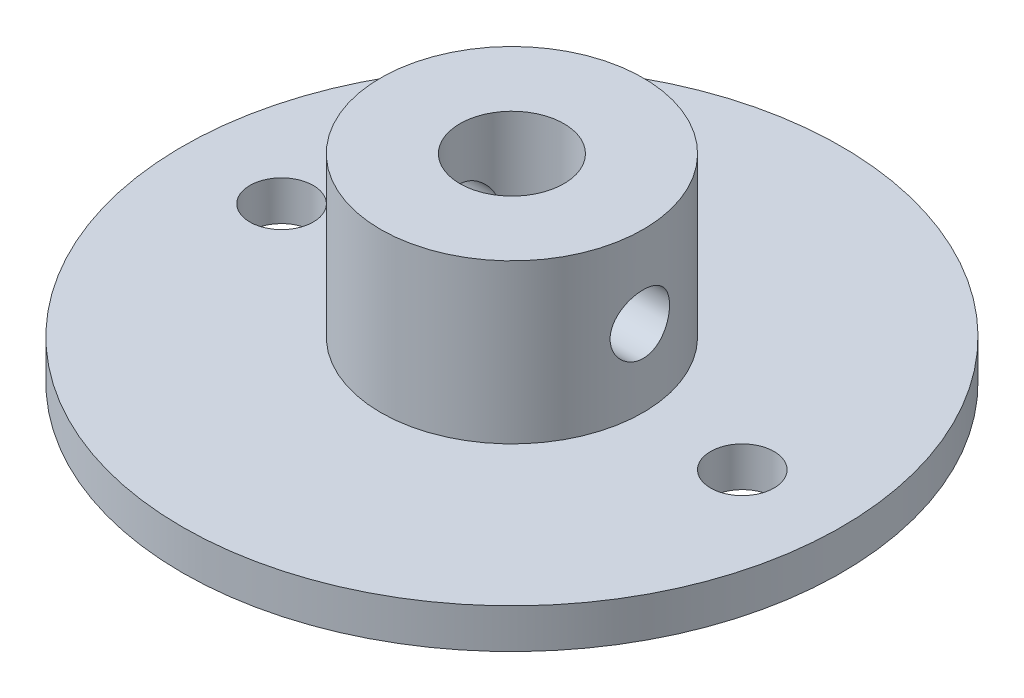
ISO-10303-21;
HEADER;
FILE_DESCRIPTION(('STEP AP214'),'2;1');
FILE_NAME('part.step','',(''),(''),'','','');
FILE_SCHEMA(('AUTOMOTIVE_DESIGN { 1 0 10303 214 1 1 1 1 }'));
ENDSEC;
DATA;
#1=APPLICATION_CONTEXT('core data for automotive mechanical design processes');
#2=APPLICATION_PROTOCOL_DEFINITION('international standard','automotive_design',2000,#1);
#3=PRODUCT_CONTEXT('',#1,'mechanical');
#4=PRODUCT('Part','Part','',(#3));
#5=PRODUCT_RELATED_PRODUCT_CATEGORY('part','',(#4));
#6=PRODUCT_DEFINITION_FORMATION('','',#4);
#7=PRODUCT_DEFINITION_CONTEXT('part definition',#1,'design');
#8=PRODUCT_DEFINITION('design','',#6,#7);
#9=PRODUCT_DEFINITION_SHAPE('','',#8);
#10=(LENGTH_UNIT() NAMED_UNIT(*) SI_UNIT(.MILLI.,.METRE.));
#11=(NAMED_UNIT(*) PLANE_ANGLE_UNIT() SI_UNIT($,.RADIAN.));
#12=(NAMED_UNIT(*) SI_UNIT($,.STERADIAN.) SOLID_ANGLE_UNIT());
#13=UNCERTAINTY_MEASURE_WITH_UNIT(LENGTH_MEASURE(1.E-05),#10,'distance_accuracy_value','');
#14=(GEOMETRIC_REPRESENTATION_CONTEXT(3) GLOBAL_UNCERTAINTY_ASSIGNED_CONTEXT((#13)) GLOBAL_UNIT_ASSIGNED_CONTEXT((#10,
#11,#12)) REPRESENTATION_CONTEXT('',''));
#15=CARTESIAN_POINT('',(0.,0.,0.));
#16=DIRECTION('',(0.,0.,1.));
#17=DIRECTION('',(1.,0.,0.));
#18=AXIS2_PLACEMENT_3D('',#15,#16,#17);
#19=CARTESIAN_POINT('',(0.,2.,0.));
#20=DIRECTION('',(0.,-1.,0.));
#21=DIRECTION('',(0.,0.,-1.));
#22=AXIS2_PLACEMENT_3D('',#19,#20,#21);
#23=CYLINDRICAL_SURFACE('',#22,2.625);
#24=CARTESIAN_POINT('',(-2.15421099245176,5.86635690056428,1.5));
#25=CARTESIAN_POINT('',(-2.154213410356,5.94267636282901,1.49999846683478));
#26=CARTESIAN_POINT('',(-2.15832800723236,6.01900685431532,1.49413889453852));
#27=CARTESIAN_POINT('',(-2.17410035010715,6.16915784709801,1.47108698307858));
#28=CARTESIAN_POINT('',(-2.18576613865971,6.24297558379517,1.45388256047928));
#29=CARTESIAN_POINT('',(-2.21481807199417,6.38564077605949,1.40922043244484));
#30=CARTESIAN_POINT('',(-2.23216700490172,6.45451710269198,1.38182927354801));
#31=CARTESIAN_POINT('',(-2.27056544457613,6.58666889979571,1.31778190275047));
#32=CARTESIAN_POINT('',(-2.29161613688751,6.64994256613967,1.2811227209738));
#33=CARTESIAN_POINT('',(-2.33784696593001,6.77672140653583,1.1948814099819));
#34=CARTESIAN_POINT('',(-2.36322673774469,6.83948944955777,1.14432240531888));
#35=CARTESIAN_POINT('',(-2.41365475868315,6.95625533146205,1.03372791105004));
#36=CARTESIAN_POINT('',(-2.43870278230869,7.01024746054418,0.973686301538308));
#37=CARTESIAN_POINT('',(-2.48847179730479,7.11298221426558,0.83890620203163));
#38=CARTESIAN_POINT('',(-2.51293635562779,7.16074097174533,0.763313833743634));
#39=CARTESIAN_POINT('',(-2.55601907174722,7.24251755306037,0.603503970442789));
#40=CARTESIAN_POINT('',(-2.5746420594799,7.27654673550378,0.519293677735656));
#41=CARTESIAN_POINT('',(-2.60247252279106,7.32671047585973,0.352512209518721));
#42=CARTESIAN_POINT('',(-2.6123668694479,7.3441611317921,0.270454354480762));
#43=CARTESIAN_POINT('',(-2.62425967295137,7.36508715352714,0.104035284087329));
#44=CARTESIAN_POINT('',(-2.62626468051096,7.36857411377361,0.0196760382706607));
#45=CARTESIAN_POINT('',(-2.62239382680748,7.36179172568415,-0.138710222840966));
#46=CARTESIAN_POINT('',(-2.61738133699802,7.35302958323498,-0.212829432876428));
#47=CARTESIAN_POINT('',(-2.60145682924538,7.32481100722972,-0.358334462040126));
#48=CARTESIAN_POINT('',(-2.5905443772895,7.3053537869211,-0.429720079666245));
#49=CARTESIAN_POINT('',(-2.56365681102638,7.25636865633978,-0.568633872572659));
#50=CARTESIAN_POINT('',(-2.54763759444919,7.22675283999775,-0.636122158038649));
#51=CARTESIAN_POINT('',(-2.51186451569419,7.15851851969427,-0.765283708141497));
#52=CARTESIAN_POINT('',(-2.49210955262886,7.11989736116383,-0.826955250592103));
#53=CARTESIAN_POINT('',(-2.44795916475191,7.02979745957233,-0.950196888773616));
#54=CARTESIAN_POINT('',(-2.42329161120224,6.97735878176881,-1.01096742043384));
#55=CARTESIAN_POINT('',(-2.37329277932437,6.86360590593109,-1.1233423553321));
#56=CARTESIAN_POINT('',(-2.3479607279311,6.80228095728977,-1.17493548488661));
#57=CARTESIAN_POINT('',(-2.2965918233969,6.66519673344145,-1.27264664922503));
#58=CARTESIAN_POINT('',(-2.27073623304799,6.58860806940179,-1.31770696092891));
#59=CARTESIAN_POINT('',(-2.22471526468373,6.42729875611887,-1.39401127129388));
#60=CARTESIAN_POINT('',(-2.20453982758185,6.34259284313391,-1.42527975054291));
#61=CARTESIAN_POINT('',(-2.17699022212036,6.18742470759616,-1.4669055010881));
#62=CARTESIAN_POINT('',(-2.16774321507442,6.11813839393469,-1.4804105196709));
#63=CARTESIAN_POINT('',(-2.15596393601327,5.97781577243006,-1.49751769610066));
#64=CARTESIAN_POINT('',(-2.15342522621994,5.90678120847904,-1.50112934847561));
#65=CARTESIAN_POINT('',(-2.1554278328926,5.76498432647355,-1.4982514731704));
#66=CARTESIAN_POINT('',(-2.15997333577545,5.69422219418952,-1.49175597266992));
#67=CARTESIAN_POINT('',(-2.17549310235151,5.55499470322094,-1.46902614605589));
#68=CARTESIAN_POINT('',(-2.18647204950687,5.48653105623283,-1.45278472483399));
#69=CARTESIAN_POINT('',(-2.21363183849242,5.35264193931424,-1.41105635132217));
#70=CARTESIAN_POINT('',(-2.22987610311222,5.28726525452064,-1.38545616208842));
#71=CARTESIAN_POINT('',(-2.26579814647668,5.1614754314429,-1.32589277240018));
#72=CARTESIAN_POINT('',(-2.28547732490761,5.10106433139319,-1.29192616039958));
#73=CARTESIAN_POINT('',(-2.32999799821444,4.97629641171451,-1.21006050671218));
#74=CARTESIAN_POINT('',(-2.35515381056001,4.91295336441179,-1.16078399703075));
#75=CARTESIAN_POINT('',(-2.40539155862019,4.79484260962052,-1.05274436338027));
#76=CARTESIAN_POINT('',(-2.4304734155811,4.74008207127617,-0.993973390827443));
#77=CARTESIAN_POINT('',(-2.48071171733659,4.63524784627181,-0.861506210224855));
#78=CARTESIAN_POINT('',(-2.50562543330508,4.58618845300096,-0.786905594447129));
#79=CARTESIAN_POINT('',(-2.54987266155477,4.5016130651392,-0.62887653667733));
#80=CARTESIAN_POINT('',(-2.56921058095153,4.46608636711995,-0.545455138319686));
#81=CARTESIAN_POINT('',(-2.59871249336349,4.41269458203668,-0.379273176169258));
#82=CARTESIAN_POINT('',(-2.6094953645405,4.39362673992937,-0.297012109632837));
#83=CARTESIAN_POINT('',(-2.62312380538285,4.3696084256662,-0.129832899393698));
#84=CARTESIAN_POINT('',(-2.62597639174623,4.36464547344892,-0.0449171718567592));
#85=CARTESIAN_POINT('',(-2.62357130524464,4.36885965578732,0.114497584791105));
#86=CARTESIAN_POINT('',(-2.61921898672107,4.37645817984132,0.189058635798018));
#87=CARTESIAN_POINT('',(-2.60449560694025,4.40249629530048,0.335637318279886));
#88=CARTESIAN_POINT('',(-2.59412423014929,4.42093645505127,0.407654816205606));
#89=CARTESIAN_POINT('',(-2.56826517567636,4.46787784488003,0.547455470188715));
#90=CARTESIAN_POINT('',(-2.55276910166976,4.4963955914084,0.615231458768146));
#91=CARTESIAN_POINT('',(-2.51792465116701,4.5624754443267,0.745123226184592));
#92=CARTESIAN_POINT('',(-2.49857522062171,4.60004002598247,0.807237449507655));
#93=CARTESIAN_POINT('',(-2.45519139122729,4.68781794339305,0.931366283757209));
#94=CARTESIAN_POINT('',(-2.43087582280009,4.738967612654,0.992619916330301));
#95=CARTESIAN_POINT('',(-2.38135762020771,4.85012992190596,1.10616766728089));
#96=CARTESIAN_POINT('',(-2.35615395575688,4.9101531324673,1.15845093701205));
#97=CARTESIAN_POINT('',(-2.3046222011013,5.04481666257692,1.25809533674068));
#98=CARTESIAN_POINT('',(-2.27845230570366,5.12032923419615,1.30436937090819));
#99=CARTESIAN_POINT('',(-2.23139756623346,5.27962577156904,1.38333486951076));
#100=CARTESIAN_POINT('',(-2.21050408988367,5.36339591148942,1.41604857577967));
#101=CARTESIAN_POINT('',(-2.18135822429552,5.51706257982882,1.46042352152626));
#102=CARTESIAN_POINT('',(-2.17130371841474,5.58571915580892,1.47519613758632));
#103=CARTESIAN_POINT('',(-2.1577320336523,5.72503425681686,1.49498053174936));
#104=CARTESIAN_POINT('',(-2.15420875365531,5.79569085081658,1.50000141959504));
#105=CARTESIAN_POINT('',(-2.15421099245176,5.86635690056428,1.5));
#106=B_SPLINE_CURVE_WITH_KNOTS('',3,(#24,#25,#26,#27,#28,#29,#30,#31,#32,#33,#34,#35,#36,#37,
#38,#39,#40,#41,#42,#43,#44,#45,#46,#47,#48,#49,#50,#51,#52,#53,#54,#55,#56,#57,#58,#59,#60,#61,
#62,#63,#64,#65,#66,#67,#68,#69,#70,#71,#72,#73,#74,#75,#76,#77,#78,#79,#80,#81,#82,#83,#84,#85,
#86,#87,#88,#89,#90,#91,#92,#93,#94,#95,#96,#97,#98,#99,#100,#101,#102,#103,#104,#105),
.UNSPECIFIED.,.T.,.F.,(4,2,2,2,2,2,2,2,2,2,2,2,2,2,2,2,2,2,2,2,2,2,2,2,2,2,2,2,2,2,2,2,2,2,2,2,
2,2,2,2,4),(0.,0.228662906191534,0.457569756202666,0.685006776012175,0.912516769075256,
1.16500270869751,1.41765226923182,1.69426906944796,1.97065655036991,2.22260820641669,
2.47435061658435,2.69769916529844,2.92106414620267,3.14641289821894,3.37182816206221,
3.62272525006744,3.87392844749658,4.15016091549103,4.42590107637656,4.63854561164719,
4.85098600325704,5.06355198416775,5.27627290287916,5.49165777926985,5.70713062819559,
5.95842639941127,6.20993097699124,6.48655387973241,6.76295753628873,7.01685033593318,
7.2705184201975,7.49466057011993,7.71881447118174,7.94333746156078,8.16792195264373,
8.41718525370328,8.66674791772896,8.94241798959586,9.21763409720668,9.42955672028129,
9.64128127683453),.UNSPECIFIED.);
#107=CARTESIAN_POINT('',(-2.15421099245176,5.86635690056428,1.5));
#108=VERTEX_POINT('',#107);
#109=EDGE_CURVE('E96',#108,#108,#106,.T.);
#110=ORIENTED_EDGE('',*,*,#109,.T.);
#111=EDGE_LOOP('',(#110));
#112=FACE_BOUND('',#111,.T.);
#113=CARTESIAN_POINT('',(0.,0.,0.));
#114=DIRECTION('',(0.,1.,0.));
#115=DIRECTION('',(0.,0.,1.));
#116=AXIS2_PLACEMENT_3D('',#113,#114,#115);
#117=CIRCLE('',#116,2.625);
#118=CARTESIAN_POINT('',(0.,0.,2.625));
#119=VERTEX_POINT('',#118);
#120=EDGE_CURVE('E52',#119,#119,#117,.T.);
#121=ORIENTED_EDGE('',*,*,#120,.F.);
#122=EDGE_LOOP('',(#121));
#123=FACE_BOUND('',#122,.T.);
#124=CARTESIAN_POINT('',(0.,10.,0.));
#125=DIRECTION('',(0.,1.,0.));
#126=DIRECTION('',(0.,0.,1.));
#127=AXIS2_PLACEMENT_3D('',#124,#125,#126);
#128=CIRCLE('',#127,2.625);
#129=CARTESIAN_POINT('',(0.,10.,2.625));
#130=VERTEX_POINT('',#129);
#131=EDGE_CURVE('E69',#130,#130,#128,.T.);
#132=ORIENTED_EDGE('',*,*,#131,.T.);
#133=EDGE_LOOP('',(#132));
#134=FACE_BOUND('',#133,.T.);
#135=CARTESIAN_POINT('',(2.15421099245176,5.86635690056428,1.5));
#136=CARTESIAN_POINT('',(2.154213410356,5.79003743829954,1.49999846683478));
#137=CARTESIAN_POINT('',(2.15832800723236,5.71370694681323,1.49413889453852));
#138=CARTESIAN_POINT('',(2.17410035010715,5.56355595403054,1.47108698307858));
#139=CARTESIAN_POINT('',(2.18576613865971,5.48973821733338,1.45388256047928));
#140=CARTESIAN_POINT('',(2.21481807199417,5.34707302506906,1.40922043244484));
#141=CARTESIAN_POINT('',(2.23216700490172,5.27819669843657,1.38182927354801));
#142=CARTESIAN_POINT('',(2.27056544457613,5.14604490133284,1.31778190275047));
#143=CARTESIAN_POINT('',(2.29161613688751,5.08277123498888,1.2811227209738));
#144=CARTESIAN_POINT('',(2.33784696593001,4.95599239459272,1.1948814099819));
#145=CARTESIAN_POINT('',(2.36322673774469,4.89322435157078,1.14432240531888));
#146=CARTESIAN_POINT('',(2.41365475868315,4.7764584696665,1.03372791105004));
#147=CARTESIAN_POINT('',(2.43870278230869,4.72246634058437,0.973686301538308));
#148=CARTESIAN_POINT('',(2.48847179730479,4.61973158686297,0.83890620203163));
#149=CARTESIAN_POINT('',(2.51293635562779,4.57197282938322,0.763313833743634));
#150=CARTESIAN_POINT('',(2.55601907174722,4.49019624806818,0.603503970442789));
#151=CARTESIAN_POINT('',(2.5746420594799,4.45616706562477,0.519293677735656));
#152=CARTESIAN_POINT('',(2.60247252279106,4.40600332526883,0.352512209518721));
#153=CARTESIAN_POINT('',(2.6123668694479,4.38855266933645,0.270454354480762));
#154=CARTESIAN_POINT('',(2.62425967295137,4.36762664760141,0.104035284087329));
#155=CARTESIAN_POINT('',(2.62626468051096,4.36413968735494,0.0196760382706607));
#156=CARTESIAN_POINT('',(2.62239382680748,4.3709220754444,-0.138710222840966));
#157=CARTESIAN_POINT('',(2.61738133699802,4.37968421789357,-0.212829432876428));
#158=CARTESIAN_POINT('',(2.60145682924538,4.40790279389884,-0.358334462040126));
#159=CARTESIAN_POINT('',(2.5905443772895,4.42736001420745,-0.429720079666245));
#160=CARTESIAN_POINT('',(2.56365681102638,4.47634514478877,-0.568633872572659));
#161=CARTESIAN_POINT('',(2.54763759444919,4.50596096113081,-0.636122158038649));
#162=CARTESIAN_POINT('',(2.51186451569419,4.57419528143428,-0.765283708141497));
#163=CARTESIAN_POINT('',(2.49210955262886,4.61281643996472,-0.826955250592103));
#164=CARTESIAN_POINT('',(2.44795916475191,4.70291634155622,-0.950196888773616));
#165=CARTESIAN_POINT('',(2.42329161120224,4.75535501935974,-1.01096742043384));
#166=CARTESIAN_POINT('',(2.37329277932437,4.86910789519746,-1.1233423553321));
#167=CARTESIAN_POINT('',(2.3479607279311,4.93043284383878,-1.17493548488661));
#168=CARTESIAN_POINT('',(2.2965918233969,5.0675170676871,-1.27264664922503));
#169=CARTESIAN_POINT('',(2.27073623304799,5.14410573172676,-1.31770696092891));
#170=CARTESIAN_POINT('',(2.22471526468373,5.30541504500968,-1.39401127129388));
#171=CARTESIAN_POINT('',(2.20453982758185,5.39012095799464,-1.42527975054291));
#172=CARTESIAN_POINT('',(2.17699022212036,5.54528909353239,-1.4669055010881));
#173=CARTESIAN_POINT('',(2.16774321507442,5.61457540719386,-1.4804105196709));
#174=CARTESIAN_POINT('',(2.15596393601327,5.75489802869849,-1.49751769610066));
#175=CARTESIAN_POINT('',(2.15342522621994,5.82593259264951,-1.50112934847561));
#176=CARTESIAN_POINT('',(2.1554278328926,5.967729474655,-1.4982514731704));
#177=CARTESIAN_POINT('',(2.15997333577545,6.03849160693904,-1.49175597266992));
#178=CARTESIAN_POINT('',(2.17549310235151,6.17771909790761,-1.46902614605589));
#179=CARTESIAN_POINT('',(2.18647204950687,6.24618274489572,-1.45278472483399));
#180=CARTESIAN_POINT('',(2.21363183849242,6.38007186181431,-1.41105635132217));
#181=CARTESIAN_POINT('',(2.22987610311222,6.44544854660791,-1.38545616208842));
#182=CARTESIAN_POINT('',(2.26579814647668,6.57123836968565,-1.32589277240018));
#183=CARTESIAN_POINT('',(2.28547732490761,6.63164946973536,-1.29192616039958));
#184=CARTESIAN_POINT('',(2.32999799821444,6.75641738941405,-1.21006050671218));
#185=CARTESIAN_POINT('',(2.35515381056001,6.81976043671676,-1.16078399703075));
#186=CARTESIAN_POINT('',(2.40539155862019,6.93787119150803,-1.05274436338027));
#187=CARTESIAN_POINT('',(2.4304734155811,6.99263172985238,-0.993973390827443));
#188=CARTESIAN_POINT('',(2.48071171733659,7.09746595485674,-0.861506210224855));
#189=CARTESIAN_POINT('',(2.50562543330508,7.14652534812759,-0.786905594447129));
#190=CARTESIAN_POINT('',(2.54987266155477,7.23110073598935,-0.62887653667733));
#191=CARTESIAN_POINT('',(2.56921058095153,7.2666274340086,-0.545455138319686));
#192=CARTESIAN_POINT('',(2.59871249336349,7.32001921909187,-0.379273176169258));
#193=CARTESIAN_POINT('',(2.6094953645405,7.33908706119918,-0.297012109632837));
#194=CARTESIAN_POINT('',(2.62312380538285,7.36310537546235,-0.129832899393698));
#195=CARTESIAN_POINT('',(2.62597639174623,7.36806832767963,-0.0449171718567592));
#196=CARTESIAN_POINT('',(2.62357130524464,7.36385414534124,0.114497584791106));
#197=CARTESIAN_POINT('',(2.61921898672107,7.35625562128723,0.189058635798018));
#198=CARTESIAN_POINT('',(2.60449560694025,7.33021750582807,0.335637318279886));
#199=CARTESIAN_POINT('',(2.59412423014929,7.31177734607729,0.407654816205606));
#200=CARTESIAN_POINT('',(2.56826517567636,7.26483595624852,0.547455470188715));
#201=CARTESIAN_POINT('',(2.55276910166976,7.23631820972015,0.615231458768145));
#202=CARTESIAN_POINT('',(2.51792465116701,7.17023835680185,0.745123226184592));
#203=CARTESIAN_POINT('',(2.49857522062171,7.13267377514608,0.807237449507654));
#204=CARTESIAN_POINT('',(2.45519139122729,7.0448958577355,0.931366283757208));
#205=CARTESIAN_POINT('',(2.4308758228001,6.99374618847455,0.992619916330301));
#206=CARTESIAN_POINT('',(2.38135762020771,6.88258387922259,1.10616766728089));
#207=CARTESIAN_POINT('',(2.35615395575688,6.82256066866125,1.15845093701205));
#208=CARTESIAN_POINT('',(2.3046222011013,6.68789713855163,1.25809533674068));
#209=CARTESIAN_POINT('',(2.27845230570366,6.6123845669324,1.30436937090819));
#210=CARTESIAN_POINT('',(2.23139756623346,6.45308802955951,1.38333486951076));
#211=CARTESIAN_POINT('',(2.21050408988367,6.36931788963913,1.41604857577967));
#212=CARTESIAN_POINT('',(2.18135822429552,6.21565122129973,1.46042352152626));
#213=CARTESIAN_POINT('',(2.17130371841474,6.14699464531963,1.47519613758632));
#214=CARTESIAN_POINT('',(2.1577320336523,6.0076795443117,1.49498053174936));
#215=CARTESIAN_POINT('',(2.15420875365531,5.93702295031197,1.50000141959504));
#216=CARTESIAN_POINT('',(2.15421099245176,5.86635690056428,1.5));
#217=B_SPLINE_CURVE_WITH_KNOTS('',3,(#135,#136,#137,#138,#139,#140,#141,#142,#143,#144,#145,
#146,#147,#148,#149,#150,#151,#152,#153,#154,#155,#156,#157,#158,#159,#160,#161,#162,#163,#164,
#165,#166,#167,#168,#169,#170,#171,#172,#173,#174,#175,#176,#177,#178,#179,#180,#181,#182,#183,
#184,#185,#186,#187,#188,#189,#190,#191,#192,#193,#194,#195,#196,#197,#198,#199,#200,#201,#202,
#203,#204,#205,#206,#207,#208,#209,#210,#211,#212,#213,#214,#215,#216),.UNSPECIFIED.,.T.,.F.,(4,
2,2,2,2,2,2,2,2,2,2,2,2,2,2,2,2,2,2,2,2,2,2,2,2,2,2,2,2,2,2,2,2,2,2,2,2,2,2,2,4),(0.,
0.228662906191534,0.457569756202666,0.685006776012179,0.912516769075256,1.16500270869751,
1.41765226923182,1.69426906944796,1.97065655036991,2.22260820641669,2.47435061658435,
2.69769916529844,2.92106414620267,3.14641289821894,3.37182816206221,3.62272525006744,
3.87392844749658,4.15016091549103,4.42590107637656,4.63854561164719,4.85098600325704,
5.06355198416775,5.27627290287916,5.49165777926985,5.70713062819559,5.95842639941127,
6.20993097699124,6.48655387973241,6.76295753628873,7.01685033593318,7.2705184201975,
7.49466057011994,7.71881447118175,7.94333746156078,8.16792195264373,8.41718525370328,
8.66674791772896,8.94241798959586,9.21763409720668,9.42955672028129,9.64128127683453),.UNSPECIFIED.);
#218=CARTESIAN_POINT('',(2.15421099245176,5.86635690056428,1.5));
#219=VERTEX_POINT('',#218);
#220=EDGE_CURVE('E101',#219,#219,#217,.T.);
#221=ORIENTED_EDGE('',*,*,#220,.T.);
#222=EDGE_LOOP('',(#221));
#223=FACE_BOUND('',#222,.T.);
#224=ADVANCED_FACE('F39',(#112,#123,#134,#223),#23,.F.);
#225=CARTESIAN_POINT('',(0.,10.,0.));
#226=DIRECTION('',(0.,-1.,0.));
#227=DIRECTION('',(0.,0.,-1.));
#228=AXIS2_PLACEMENT_3D('',#225,#226,#227);
#229=CYLINDRICAL_SURFACE('',#228,6.625);
#230=CARTESIAN_POINT('',(0.,10.,0.));
#231=DIRECTION('',(0.,1.,0.));
#232=DIRECTION('',(0.,0.,1.));
#233=AXIS2_PLACEMENT_3D('',#230,#231,#232);
#234=CIRCLE('',#233,6.625);
#235=CARTESIAN_POINT('',(0.,10.,6.625));
#236=VERTEX_POINT('',#235);
#237=EDGE_CURVE('E64',#236,#236,#234,.T.);
#238=ORIENTED_EDGE('',*,*,#237,.F.);
#239=EDGE_LOOP('',(#238));
#240=FACE_BOUND('',#239,.T.);
#241=CARTESIAN_POINT('',(0.,2.,0.));
#242=DIRECTION('',(0.,1.,0.));
#243=DIRECTION('',(0.,0.,1.));
#244=AXIS2_PLACEMENT_3D('',#241,#242,#243);
#245=CIRCLE('',#244,6.625);
#246=CARTESIAN_POINT('',(0.,2.,6.625));
#247=VERTEX_POINT('',#246);
#248=EDGE_CURVE('E61',#247,#247,#245,.T.);
#249=ORIENTED_EDGE('',*,*,#248,.T.);
#250=EDGE_LOOP('',(#249));
#251=FACE_BOUND('',#250,.T.);
#252=CARTESIAN_POINT('',(-6.45295474957015,5.86635690056428,1.5));
#253=CARTESIAN_POINT('',(-6.45295642408947,5.94944554078049,1.49999724682627));
#254=CARTESIAN_POINT('',(-6.45457702183006,6.03256662210276,1.49307278697435));
#255=CARTESIAN_POINT('',(-6.46087132930948,6.19643956458557,1.46559141821416));
#256=CARTESIAN_POINT('',(-6.46554714458434,6.27718975168679,1.44502510772947));
#257=CARTESIAN_POINT('',(-6.47739579537806,6.43392680099792,1.39094528456798));
#258=CARTESIAN_POINT('',(-6.48456577778162,6.50991898925056,1.35744656068641));
#259=CARTESIAN_POINT('',(-6.50059142855476,6.65520804561113,1.27849583773724));
#260=CARTESIAN_POINT('',(-6.50944708756344,6.7245049508961,1.23304390504767));
#261=CARTESIAN_POINT('',(-6.52802531677769,6.85569038156209,1.13060026782679));
#262=CARTESIAN_POINT('',(-6.53775964201112,6.9174401191308,1.07343293695899));
#263=CARTESIAN_POINT('',(-6.55689570562118,7.03056117399644,0.949560223659998));
#264=CARTESIAN_POINT('',(-6.56629741692896,7.08193164820162,0.882854067155496));
#265=CARTESIAN_POINT('',(-6.58383744503881,7.17338939308237,0.740861910470228));
#266=CARTESIAN_POINT('',(-6.59196027257763,7.21334249950377,0.665487416349082));
#267=CARTESIAN_POINT('',(-6.60589421683397,7.27996238335438,0.50887917038392));
#268=CARTESIAN_POINT('',(-6.61170561186049,7.3066307604347,0.427646125333431));
#269=CARTESIAN_POINT('',(-6.62027882848949,7.34548576214904,0.263070742263549));
#270=CARTESIAN_POINT('',(-6.62309010078534,7.35790747778833,0.179786527197891));
#271=CARTESIAN_POINT('',(-6.62551788277382,7.36865226151332,0.0122720547898041));
#272=CARTESIAN_POINT('',(-6.62513478299228,7.36697705300879,-0.0719580856518173));
#273=CARTESIAN_POINT('',(-6.62125454923521,7.3497492282991,-0.237350484675489));
#274=CARTESIAN_POINT('',(-6.61781429713384,7.33445009030498,-0.318540678309624));
#275=CARTESIAN_POINT('',(-6.60827143979407,7.29081343718871,-0.477170375159977));
#276=CARTESIAN_POINT('',(-6.60216870868581,7.26247530563898,-0.554609700859954));
#277=CARTESIAN_POINT('',(-6.58789616178326,7.19334541200442,-0.704234665315422));
#278=CARTESIAN_POINT('',(-6.57971071232969,7.15245895634385,-0.776375001252022));
#279=CARTESIAN_POINT('',(-6.56216805657475,7.05946390690367,-0.912862231028328));
#280=CARTESIAN_POINT('',(-6.55281068014302,7.00735368296106,-0.977207990644504));
#281=CARTESIAN_POINT('',(-6.53370500032879,6.89201512145337,-1.09778825798192));
#282=CARTESIAN_POINT('',(-6.52395263195863,6.82856498098717,-1.15381015734637));
#283=CARTESIAN_POINT('',(-6.50535032713459,6.69306905213158,-1.25445984487059));
#284=CARTESIAN_POINT('',(-6.49650041882425,6.62102299582723,-1.29908727775481));
#285=CARTESIAN_POINT('',(-6.48069331629836,6.47001964665759,-1.37578521059746));
#286=CARTESIAN_POINT('',(-6.47374258638442,6.39103992937483,-1.40781298336005));
#287=CARTESIAN_POINT('',(-6.46260854925499,6.22862408945619,-1.45807593847456));
#288=CARTESIAN_POINT('',(-6.4584247680775,6.1451887326927,-1.47631348308794));
#289=CARTESIAN_POINT('',(-6.45339568908762,5.978179556799,-1.49814318801574));
#290=CARTESIAN_POINT('',(-6.45247958030077,5.89464843230456,-1.50204603974604));
#291=CARTESIAN_POINT('',(-6.45389814633341,5.72812904426965,-1.49593895099131));
#292=CARTESIAN_POINT('',(-6.45623258047825,5.64514074099502,-1.4859300405522));
#293=CARTESIAN_POINT('',(-6.46382209627436,5.48316115217714,-1.45255381013817));
#294=CARTESIAN_POINT('',(-6.46903924548204,5.40413219777774,-1.42935987450481));
#295=CARTESIAN_POINT('',(-6.48177171084918,5.25108245273472,-1.37046075917537));
#296=CARTESIAN_POINT('',(-6.48928725974734,5.17706217020269,-1.33475431239394));
#297=CARTESIAN_POINT('',(-6.50592376245626,5.03479297157087,-1.25116733137017));
#298=CARTESIAN_POINT('',(-6.51506902626582,4.96665863091035,-1.20309672351148));
#299=CARTESIAN_POINT('',(-6.53387148448688,4.83930961012661,-1.096392686581));
#300=CARTESIAN_POINT('',(-6.54352874713231,4.78009612294315,-1.03775784710705));
#301=CARTESIAN_POINT('',(-6.56250204028584,4.67105146009477,-0.91017909261289));
#302=CARTESIAN_POINT('',(-6.57180730689819,4.62143284815408,-0.841051616095058));
#303=CARTESIAN_POINT('',(-6.58882483223073,4.53451198796415,-0.695262707567057));
#304=CARTESIAN_POINT('',(-6.59653716800212,4.49720914394004,-0.618601640226973));
#305=CARTESIAN_POINT('',(-6.60945474900849,4.43626860266686,-0.460415435456587));
#306=CARTESIAN_POINT('',(-6.6146764497297,4.41254100053025,-0.378926338871891));
#307=CARTESIAN_POINT('',(-6.62209579392399,4.37914586628277,-0.212986300303963));
#308=CARTESIAN_POINT('',(-6.62429391026024,4.36947613562563,-0.128535823574652));
#309=CARTESIAN_POINT('',(-6.62540313857071,4.36457597225274,0.038916964321137));
#310=CARTESIAN_POINT('',(-6.62438629159635,4.36902908122939,0.121909693680413));
#311=CARTESIAN_POINT('',(-6.61933546055461,4.39153636421485,0.28593114759856));
#312=CARTESIAN_POINT('',(-6.61530153845008,4.40959025889911,0.36695991245685));
#313=CARTESIAN_POINT('',(-6.60467654287629,4.45863047861966,0.524488106193781));
#314=CARTESIAN_POINT('',(-6.59809493067599,4.48956898639077,0.601003100114228));
#315=CARTESIAN_POINT('',(-6.58307494664006,4.5634546587807,0.74779661387741));
#316=CARTESIAN_POINT('',(-6.57463638099915,4.60640307696861,0.818074481692781));
#317=CARTESIAN_POINT('',(-6.55660790578947,4.70410569396481,0.951932730503662));
#318=CARTESIAN_POINT('',(-6.54699819681536,4.75908066508293,1.01534931630267));
#319=CARTESIAN_POINT('',(-6.52781277355932,4.87883436113977,1.13216508251542));
#320=CARTESIAN_POINT('',(-6.51823706812303,4.94361546956529,1.18556182041151));
#321=CARTESIAN_POINT('',(-6.5000476739213,5.08227718397819,1.28157479262089));
#322=CARTESIAN_POINT('',(-6.49145001829658,5.15627652331952,1.32402278091385));
#323=CARTESIAN_POINT('',(-6.47639471189801,5.31053959879703,1.39581233953704));
#324=CARTESIAN_POINT('',(-6.46993530912679,5.39079813943585,1.42516464682845));
#325=CARTESIAN_POINT('',(-6.46103972120022,5.53696827422463,1.46488970114215));
#326=CARTESIAN_POINT('',(-6.45802858547415,5.60210681876581,1.47803003975144));
#327=CARTESIAN_POINT('',(-6.45398548617144,5.73360901888457,1.49558604458973));
#328=CARTESIAN_POINT('',(-6.45295341170034,5.79997260560789,1.50000219966889));
#329=CARTESIAN_POINT('',(-6.45295474957015,5.86635690056428,1.5));
#330=B_SPLINE_CURVE_WITH_KNOTS('',3,(#252,#253,#254,#255,#256,#257,#258,#259,#260,#261,#262,
#263,#264,#265,#266,#267,#268,#269,#270,#271,#272,#273,#274,#275,#276,#277,#278,#279,#280,#281,
#282,#283,#284,#285,#286,#287,#288,#289,#290,#291,#292,#293,#294,#295,#296,#297,#298,#299,#300,
#301,#302,#303,#304,#305,#306,#307,#308,#309,#310,#311,#312,#313,#314,#315,#316,#317,#318,#319,
#320,#321,#322,#323,#324,#325,#326,#327,#328,#329),.UNSPECIFIED.,.T.,.F.,(4,2,2,2,2,2,2,2,2,2,2,
2,2,2,2,2,2,2,2,2,2,2,2,2,2,2,2,2,2,2,2,2,2,2,2,2,2,2,4),(0.,0.249022518822341,0.49821683545765,
0.747127027293089,0.996035836920355,1.24899206641552,1.50196883490665,1.75780636636884,
2.01361308427295,2.26513496814651,2.51662610283192,2.76353370271407,3.01045297652595,
3.25928340849403,3.50815000550199,3.7625601835645,4.01697829308043,4.27225188216389,
4.52748173305472,4.77714592851803,5.02679163948714,5.27322800808274,5.51968933938859,
5.77019313353292,6.02073039658121,6.27630466033227,6.53186655887459,6.78571574760495,
7.03952523194302,7.2876879797687,7.53584563111948,7.78309041505553,8.03036101551909,
8.28262206805917,8.5349445340987,8.7909400404239,9.04672527225581,9.24569483876236,
9.44465325590899),.UNSPECIFIED.);
#331=CARTESIAN_POINT('',(-6.45295474957015,5.86635690056428,1.5));
#332=VERTEX_POINT('',#331);
#333=EDGE_CURVE('E74',#332,#332,#330,.T.);
#334=ORIENTED_EDGE('',*,*,#333,.F.);
#335=EDGE_LOOP('',(#334));
#336=FACE_BOUND('',#335,.T.);
#337=CARTESIAN_POINT('',(6.45295474957015,5.86635690056428,1.5));
#338=CARTESIAN_POINT('',(6.45295642408947,5.78326826034807,1.49999724682627));
#339=CARTESIAN_POINT('',(6.45457702183006,5.70014717902579,1.49307278697435));
#340=CARTESIAN_POINT('',(6.46087132930948,5.53627423654298,1.46559141821416));
#341=CARTESIAN_POINT('',(6.46554714458434,5.45552404944176,1.44502510772947));
#342=CARTESIAN_POINT('',(6.47739579537806,5.29878700013063,1.39094528456798));
#343=CARTESIAN_POINT('',(6.48456577778162,5.22279481187799,1.35744656068641));
#344=CARTESIAN_POINT('',(6.50059142855476,5.07750575551742,1.27849583773724));
#345=CARTESIAN_POINT('',(6.50944708756344,5.00820885023245,1.23304390504767));
#346=CARTESIAN_POINT('',(6.52802531677769,4.87702341956646,1.13060026782679));
#347=CARTESIAN_POINT('',(6.53775964201112,4.81527368199775,1.07343293695899));
#348=CARTESIAN_POINT('',(6.55689570562118,4.70215262713211,0.949560223659998));
#349=CARTESIAN_POINT('',(6.56629741692896,4.65078215292693,0.882854067155496));
#350=CARTESIAN_POINT('',(6.58383744503881,4.55932440804618,0.740861910470228));
#351=CARTESIAN_POINT('',(6.59196027257763,4.51937130162478,0.665487416349082));
#352=CARTESIAN_POINT('',(6.60589421683397,4.45275141777418,0.50887917038392));
#353=CARTESIAN_POINT('',(6.61170561186049,4.42608304069385,0.427646125333431));
#354=CARTESIAN_POINT('',(6.62027882848949,4.38722803897951,0.263070742263549));
#355=CARTESIAN_POINT('',(6.62309010078534,4.37480632334022,0.179786527197891));
#356=CARTESIAN_POINT('',(6.62551788277382,4.36406153961523,0.0122720547898041));
#357=CARTESIAN_POINT('',(6.62513478299228,4.36573674811976,-0.0719580856518173));
#358=CARTESIAN_POINT('',(6.62125454923521,4.38296457282945,-0.237350484675489));
#359=CARTESIAN_POINT('',(6.61781429713384,4.39826371082357,-0.318540678309624));
#360=CARTESIAN_POINT('',(6.60827143979407,4.44190036393984,-0.477170375159977));
#361=CARTESIAN_POINT('',(6.60216870868581,4.47023849548957,-0.554609700859954));
#362=CARTESIAN_POINT('',(6.58789616178326,4.53936838912413,-0.704234665315422));
#363=CARTESIAN_POINT('',(6.57971071232969,4.5802548447847,-0.776375001252022));
#364=CARTESIAN_POINT('',(6.56216805657475,4.67324989422489,-0.912862231028328));
#365=CARTESIAN_POINT('',(6.55281068014302,4.72536011816749,-0.977207990644504));
#366=CARTESIAN_POINT('',(6.53370500032879,4.84069867967518,-1.09778825798192));
#367=CARTESIAN_POINT('',(6.52395263195863,4.90414882014138,-1.15381015734637));
#368=CARTESIAN_POINT('',(6.50535032713459,5.03964474899697,-1.25445984487059));
#369=CARTESIAN_POINT('',(6.49650041882425,5.11169080530132,-1.29908727775481));
#370=CARTESIAN_POINT('',(6.48069331629836,5.26269415447096,-1.37578521059746));
#371=CARTESIAN_POINT('',(6.47374258638442,5.34167387175372,-1.40781298336005));
#372=CARTESIAN_POINT('',(6.46260854925499,5.50408971167236,-1.45807593847456));
#373=CARTESIAN_POINT('',(6.4584247680775,5.58752506843585,-1.47631348308794));
#374=CARTESIAN_POINT('',(6.45339568908762,5.75453424432956,-1.49814318801574));
#375=CARTESIAN_POINT('',(6.45247958030077,5.83806536882399,-1.50204603974604));
#376=CARTESIAN_POINT('',(6.45389814633341,6.0045847568589,-1.49593895099131));
#377=CARTESIAN_POINT('',(6.45623258047825,6.08757306013353,-1.4859300405522));
#378=CARTESIAN_POINT('',(6.46382209627436,6.24955264895141,-1.45255381013817));
#379=CARTESIAN_POINT('',(6.46903924548204,6.32858160335082,-1.42935987450481));
#380=CARTESIAN_POINT('',(6.48177171084918,6.48163134839383,-1.37046075917537));
#381=CARTESIAN_POINT('',(6.48928725974734,6.55565163092587,-1.33475431239394));
#382=CARTESIAN_POINT('',(6.50592376245626,6.69792082955768,-1.25116733137017));
#383=CARTESIAN_POINT('',(6.51506902626582,6.7660551702182,-1.20309672351148));
#384=CARTESIAN_POINT('',(6.53387148448688,6.89340419100194,-1.096392686581));
#385=CARTESIAN_POINT('',(6.54352874713231,6.9526176781854,-1.03775784710705));
#386=CARTESIAN_POINT('',(6.56250204028584,7.06166234103378,-0.91017909261289));
#387=CARTESIAN_POINT('',(6.57180730689819,7.11128095297447,-0.841051616095058));
#388=CARTESIAN_POINT('',(6.58882483223073,7.1982018131644,-0.695262707567057));
#389=CARTESIAN_POINT('',(6.59653716800212,7.23550465718851,-0.618601640226973));
#390=CARTESIAN_POINT('',(6.60945474900849,7.29644519846169,-0.460415435456587));
#391=CARTESIAN_POINT('',(6.6146764497297,7.3201728005983,-0.378926338871891));
#392=CARTESIAN_POINT('',(6.62209579392399,7.35356793484578,-0.212986300303963));
#393=CARTESIAN_POINT('',(6.62429391026024,7.36323766550292,-0.128535823574652));
#394=CARTESIAN_POINT('',(6.62540313857071,7.36813782887581,0.038916964321137));
#395=CARTESIAN_POINT('',(6.62438629159635,7.36368471989917,0.121909693680413));
#396=CARTESIAN_POINT('',(6.61933546055461,7.3411774369137,0.28593114759856));
#397=CARTESIAN_POINT('',(6.61530153845008,7.32312354222945,0.36695991245685));
#398=CARTESIAN_POINT('',(6.60467654287629,7.27408332250889,0.524488106193781));
#399=CARTESIAN_POINT('',(6.59809493067599,7.24314481473778,0.601003100114228));
#400=CARTESIAN_POINT('',(6.58307494664006,7.16925914234785,0.74779661387741));
#401=CARTESIAN_POINT('',(6.57463638099915,7.12631072415994,0.818074481692781));
#402=CARTESIAN_POINT('',(6.55660790578947,7.02860810716374,0.951932730503662));
#403=CARTESIAN_POINT('',(6.54699819681536,6.97363313604562,1.01534931630267));
#404=CARTESIAN_POINT('',(6.52781277355932,6.85387943998878,1.13216508251542));
#405=CARTESIAN_POINT('',(6.51823706812303,6.78909833156326,1.18556182041151));
#406=CARTESIAN_POINT('',(6.5000476739213,6.65043661715036,1.28157479262089));
#407=CARTESIAN_POINT('',(6.49145001829658,6.57643727780904,1.32402278091385));
#408=CARTESIAN_POINT('',(6.47639471189801,6.42217420233153,1.39581233953704));
#409=CARTESIAN_POINT('',(6.46993530912679,6.3419156616927,1.42516464682845));
#410=CARTESIAN_POINT('',(6.46103972120022,6.19574552690392,1.46488970114215));
#411=CARTESIAN_POINT('',(6.45802858547415,6.13060698236274,1.47803003975144));
#412=CARTESIAN_POINT('',(6.45398548617144,5.99910478224399,1.49558604458973));
#413=CARTESIAN_POINT('',(6.45295341170034,5.93274119552066,1.50000219966889));
#414=CARTESIAN_POINT('',(6.45295474957015,5.86635690056428,1.5));
#415=B_SPLINE_CURVE_WITH_KNOTS('',3,(#337,#338,#339,#340,#341,#342,#343,#344,#345,#346,#347,
#348,#349,#350,#351,#352,#353,#354,#355,#356,#357,#358,#359,#360,#361,#362,#363,#364,#365,#366,
#367,#368,#369,#370,#371,#372,#373,#374,#375,#376,#377,#378,#379,#380,#381,#382,#383,#384,#385,
#386,#387,#388,#389,#390,#391,#392,#393,#394,#395,#396,#397,#398,#399,#400,#401,#402,#403,#404,
#405,#406,#407,#408,#409,#410,#411,#412,#413,#414),.UNSPECIFIED.,.T.,.F.,(4,2,2,2,2,2,2,2,2,2,2,
2,2,2,2,2,2,2,2,2,2,2,2,2,2,2,2,2,2,2,2,2,2,2,2,2,2,2,4),(0.,0.249022518822341,0.49821683545765,
0.747127027293089,0.996035836920355,1.24899206641552,1.50196883490665,1.75780636636884,
2.01361308427295,2.26513496814651,2.51662610283192,2.76353370271407,3.01045297652595,
3.25928340849403,3.50815000550199,3.7625601835645,4.01697829308043,4.27225188216389,
4.52748173305472,4.77714592851803,5.02679163948714,5.27322800808274,5.51968933938859,
5.77019313353292,6.02073039658121,6.27630466033227,6.53186655887459,6.78571574760495,
7.03952523194302,7.2876879797687,7.53584563111948,7.78309041505553,8.03036101551909,
8.28262206805916,8.5349445340987,8.7909400404239,9.04672527225581,9.24569483876235,
9.44465325590899),.UNSPECIFIED.);
#416=CARTESIAN_POINT('',(6.45295474957015,5.86635690056428,1.5));
#417=VERTEX_POINT('',#416);
#418=EDGE_CURVE('E43',#417,#417,#415,.T.);
#419=ORIENTED_EDGE('',*,*,#418,.F.);
#420=EDGE_LOOP('',(#419));
#421=FACE_BOUND('',#420,.T.);
#422=ADVANCED_FACE('F79',(#240,#251,#336,#421),#229,.T.);
#423=CARTESIAN_POINT('',(0.,2.,0.));
#424=DIRECTION('',(0.,1.,0.));
#425=DIRECTION('',(0.,0.,1.));
#426=AXIS2_PLACEMENT_3D('',#423,#424,#425);
#427=PLANE('',#426);
#428=CARTESIAN_POINT('',(-11.625,2.,0.));
#429=DIRECTION('',(0.,1.,0.));
#430=DIRECTION('',(0.,0.,-1.));
#431=AXIS2_PLACEMENT_3D('',#428,#429,#430);
#432=CIRCLE('',#431,1.6);
#433=CARTESIAN_POINT('',(-11.625,2.,-1.6));
#434=VERTEX_POINT('',#433);
#435=EDGE_CURVE('E73',#434,#434,#432,.T.);
#436=ORIENTED_EDGE('',*,*,#435,.F.);
#437=EDGE_LOOP('',(#436));
#438=FACE_BOUND('',#437,.T.);
#439=CARTESIAN_POINT('',(11.625,2.,0.));
#440=DIRECTION('',(0.,1.,0.));
#441=DIRECTION('',(0.,0.,1.));
#442=AXIS2_PLACEMENT_3D('',#439,#440,#441);
#443=CIRCLE('',#442,1.6);
#444=CARTESIAN_POINT('',(11.625,2.,1.6));
#445=VERTEX_POINT('',#444);
#446=EDGE_CURVE('E70',#445,#445,#443,.T.);
#447=ORIENTED_EDGE('',*,*,#446,.F.);
#448=EDGE_LOOP('',(#447));
#449=FACE_BOUND('',#448,.T.);
#450=CARTESIAN_POINT('',(0.,2.,0.));
#451=DIRECTION('',(0.,1.,0.));
#452=DIRECTION('',(0.,0.,1.));
#453=AXIS2_PLACEMENT_3D('',#450,#451,#452);
#454=CIRCLE('',#453,16.63);
#455=CARTESIAN_POINT('',(0.,2.,16.63));
#456=VERTEX_POINT('',#455);
#457=EDGE_CURVE('E10',#456,#456,#454,.T.);
#458=ORIENTED_EDGE('',*,*,#457,.T.);
#459=EDGE_LOOP('',(#458));
#460=FACE_BOUND('',#459,.T.);
#461=ORIENTED_EDGE('',*,*,#248,.F.);
#462=EDGE_LOOP('',(#461));
#463=FACE_BOUND('',#462,.T.);
#464=ADVANCED_FACE('F115',(#438,#449,#460,#463),#427,.T.);
#465=CARTESIAN_POINT('',(0.,2.,0.));
#466=DIRECTION('',(0.,-1.,0.));
#467=DIRECTION('',(0.,0.,-1.));
#468=AXIS2_PLACEMENT_3D('',#465,#466,#467);
#469=CYLINDRICAL_SURFACE('',#468,16.63);
#470=ORIENTED_EDGE('',*,*,#457,.F.);
#471=EDGE_LOOP('',(#470));
#472=FACE_BOUND('',#471,.T.);
#473=CARTESIAN_POINT('',(0.,0.,0.));
#474=DIRECTION('',(0.,1.,0.));
#475=DIRECTION('',(0.,0.,1.));
#476=AXIS2_PLACEMENT_3D('',#473,#474,#475);
#477=CIRCLE('',#476,16.63);
#478=CARTESIAN_POINT('',(0.,0.,16.63));
#479=VERTEX_POINT('',#478);
#480=EDGE_CURVE('E57',#479,#479,#477,.T.);
#481=ORIENTED_EDGE('',*,*,#480,.T.);
#482=EDGE_LOOP('',(#481));
#483=FACE_BOUND('',#482,.T.);
#484=ADVANCED_FACE('F41',(#472,#483),#469,.T.);
#485=CARTESIAN_POINT('',(0.,0.,0.));
#486=DIRECTION('',(0.,1.,0.));
#487=DIRECTION('',(0.,0.,1.));
#488=AXIS2_PLACEMENT_3D('',#485,#486,#487);
#489=PLANE('',#488);
#490=CARTESIAN_POINT('',(-11.625,0.,0.));
#491=DIRECTION('',(0.,1.,0.));
#492=DIRECTION('',(0.,0.,1.));
#493=AXIS2_PLACEMENT_3D('',#490,#491,#492);
#494=CIRCLE('',#493,1.6);
#495=CARTESIAN_POINT('',(-11.625,0.,1.6));
#496=VERTEX_POINT('',#495);
#497=EDGE_CURVE('E71',#496,#496,#494,.T.);
#498=ORIENTED_EDGE('',*,*,#497,.T.);
#499=EDGE_LOOP('',(#498));
#500=FACE_BOUND('',#499,.T.);
#501=CARTESIAN_POINT('',(11.625,0.,0.));
#502=DIRECTION('',(0.,1.,0.));
#503=DIRECTION('',(0.,0.,1.));
#504=AXIS2_PLACEMENT_3D('',#501,#502,#503);
#505=CIRCLE('',#504,1.6);
#506=CARTESIAN_POINT('',(11.625,0.,1.6));
#507=VERTEX_POINT('',#506);
#508=EDGE_CURVE('E66',#507,#507,#505,.T.);
#509=ORIENTED_EDGE('',*,*,#508,.T.);
#510=EDGE_LOOP('',(#509));
#511=FACE_BOUND('',#510,.T.);
#512=ORIENTED_EDGE('',*,*,#480,.F.);
#513=EDGE_LOOP('',(#512));
#514=FACE_BOUND('',#513,.T.);
#515=ORIENTED_EDGE('',*,*,#120,.T.);
#516=EDGE_LOOP('',(#515));
#517=FACE_BOUND('',#516,.T.);
#518=ADVANCED_FACE('F110',(#500,#511,#514,#517),#489,.F.);
#519=CARTESIAN_POINT('',(0.,10.,0.));
#520=DIRECTION('',(0.,1.,0.));
#521=DIRECTION('',(0.,0.,1.));
#522=AXIS2_PLACEMENT_3D('',#519,#520,#521);
#523=PLANE('',#522);
#524=ORIENTED_EDGE('',*,*,#237,.T.);
#525=EDGE_LOOP('',(#524));
#526=FACE_BOUND('',#525,.T.);
#527=ORIENTED_EDGE('',*,*,#131,.F.);
#528=EDGE_LOOP('',(#527));
#529=FACE_BOUND('',#528,.T.);
#530=ADVANCED_FACE('F113',(#526,#529),#523,.T.);
#531=CARTESIAN_POINT('',(11.625,-6.,0.));
#532=DIRECTION('',(0.,1.,0.));
#533=DIRECTION('',(0.,0.,1.));
#534=AXIS2_PLACEMENT_3D('',#531,#532,#533);
#535=CYLINDRICAL_SURFACE('',#534,1.6);
#536=ORIENTED_EDGE('',*,*,#446,.T.);
#537=EDGE_LOOP('',(#536));
#538=FACE_BOUND('',#537,.T.);
#539=ORIENTED_EDGE('',*,*,#508,.F.);
#540=EDGE_LOOP('',(#539));
#541=FACE_BOUND('',#540,.T.);
#542=ADVANCED_FACE('F149',(#538,#541),#535,.F.);
#543=CARTESIAN_POINT('',(-11.625,-6.,0.));
#544=DIRECTION('',(0.,1.,0.));
#545=DIRECTION('',(0.,0.,1.));
#546=AXIS2_PLACEMENT_3D('',#543,#544,#545);
#547=CYLINDRICAL_SURFACE('',#546,1.6);
#548=ORIENTED_EDGE('',*,*,#435,.T.);
#549=EDGE_LOOP('',(#548));
#550=FACE_BOUND('',#549,.T.);
#551=ORIENTED_EDGE('',*,*,#497,.F.);
#552=EDGE_LOOP('',(#551));
#553=FACE_BOUND('',#552,.T.);
#554=ADVANCED_FACE('F89',(#550,#553),#547,.F.);
#555=CARTESIAN_POINT('',(10.,5.86635690056428,0.));
#556=DIRECTION('',(-1.,0.,0.));
#557=DIRECTION('',(0.,0.,1.));
#558=AXIS2_PLACEMENT_3D('',#555,#556,#557);
#559=CYLINDRICAL_SURFACE('',#558,1.5);
#560=ORIENTED_EDGE('',*,*,#109,.F.);
#561=EDGE_LOOP('',(#560));
#562=FACE_BOUND('',#561,.T.);
#563=ORIENTED_EDGE('',*,*,#333,.T.);
#564=EDGE_LOOP('',(#563));
#565=FACE_BOUND('',#564,.T.);
#566=ADVANCED_FACE('F87',(#562,#565),#559,.F.);
#567=ORIENTED_EDGE('',*,*,#220,.F.);
#568=EDGE_LOOP('',(#567));
#569=FACE_BOUND('',#568,.T.);
#570=ORIENTED_EDGE('',*,*,#418,.T.);
#571=EDGE_LOOP('',(#570));
#572=FACE_BOUND('',#571,.T.);
#573=ADVANCED_FACE('F83',(#569,#572),#559,.F.);
#574=CLOSED_SHELL('',(#224,#422,#464,#484,#518,#530,#542,#554,#566,#573));
#575=MANIFOLD_SOLID_BREP('B2',#574);
#576=ADVANCED_BREP_SHAPE_REPRESENTATION('',(#18,#575),#14);
#577=SHAPE_DEFINITION_REPRESENTATION(#9,#576);
ENDSEC;
END-ISO-10303-21;
